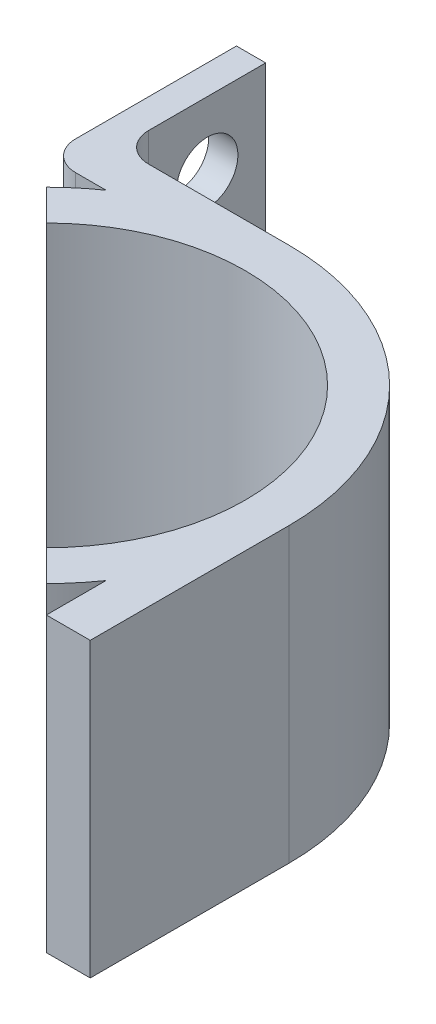
ISO-10303-21;
HEADER;
FILE_DESCRIPTION(('STEP AP214'),'2;1');
FILE_NAME('part.step','',(''),(''),'','','');
FILE_SCHEMA(('AUTOMOTIVE_DESIGN { 1 0 10303 214 1 1 1 1 }'));
ENDSEC;
DATA;
#1=APPLICATION_CONTEXT('core data for automotive mechanical design processes');
#2=APPLICATION_PROTOCOL_DEFINITION('international standard','automotive_design',2000,#1);
#3=PRODUCT_CONTEXT('',#1,'mechanical');
#4=PRODUCT('Part','Part','',(#3));
#5=PRODUCT_RELATED_PRODUCT_CATEGORY('part','',(#4));
#6=PRODUCT_DEFINITION_FORMATION('','',#4);
#7=PRODUCT_DEFINITION_CONTEXT('part definition',#1,'design');
#8=PRODUCT_DEFINITION('design','',#6,#7);
#9=PRODUCT_DEFINITION_SHAPE('','',#8);
#10=(LENGTH_UNIT() NAMED_UNIT(*) SI_UNIT(.MILLI.,.METRE.));
#11=(NAMED_UNIT(*) PLANE_ANGLE_UNIT() SI_UNIT($,.RADIAN.));
#12=(NAMED_UNIT(*) SI_UNIT($,.STERADIAN.) SOLID_ANGLE_UNIT());
#13=UNCERTAINTY_MEASURE_WITH_UNIT(LENGTH_MEASURE(1.E-05),#10,'distance_accuracy_value','');
#14=(GEOMETRIC_REPRESENTATION_CONTEXT(3) GLOBAL_UNCERTAINTY_ASSIGNED_CONTEXT((#13)) GLOBAL_UNIT_ASSIGNED_CONTEXT((#10,
#11,#12)) REPRESENTATION_CONTEXT('',''));
#15=CARTESIAN_POINT('',(0.,0.,0.));
#16=DIRECTION('',(0.,0.,1.));
#17=DIRECTION('',(1.,0.,0.));
#18=AXIS2_PLACEMENT_3D('',#15,#16,#17);
#19=CARTESIAN_POINT('',(0.,20.,7.17807043970219));
#20=DIRECTION('',(0.,0.,-1.));
#21=DIRECTION('',(-1.,0.,0.));
#22=AXIS2_PLACEMENT_3D('',#19,#20,#21);
#23=PLANE('',#22);
#24=DIRECTION('',(1.,0.,0.));
#25=VECTOR('',#24,1.);
#26=CARTESIAN_POINT('',(0.,20.,7.17807043970219));
#27=LINE('',#26,#25);
#28=CARTESIAN_POINT('',(-28.2,20.,7.17807043970219));
#29=VERTEX_POINT('',#28);
#30=CARTESIAN_POINT('',(-26.1184032274326,20.,7.17807043970219));
#31=VERTEX_POINT('',#30);
#32=EDGE_CURVE('E195',#29,#31,#27,.T.);
#33=ORIENTED_EDGE('',*,*,#32,.F.);
#34=DIRECTION('',(0.,-1.,0.));
#35=VECTOR('',#34,1.);
#36=CARTESIAN_POINT('',(-28.2,20.,7.17807043970219));
#37=LINE('',#36,#35);
#38=CARTESIAN_POINT('',(-28.2,0.,7.17807043970219));
#39=VERTEX_POINT('',#38);
#40=EDGE_CURVE('E323',#29,#39,#37,.T.);
#41=ORIENTED_EDGE('',*,*,#40,.T.);
#42=DIRECTION('',(1.,0.,0.));
#43=VECTOR('',#42,1.);
#44=CARTESIAN_POINT('',(0.,0.,7.17807043970219));
#45=LINE('',#44,#43);
#46=CARTESIAN_POINT('',(-26.1184032274326,0.,7.17807043970219));
#47=VERTEX_POINT('',#46);
#48=EDGE_CURVE('E193',#39,#47,#45,.T.);
#49=ORIENTED_EDGE('',*,*,#48,.T.);
#50=DIRECTION('',(0.,-1.,0.));
#51=VECTOR('',#50,1.);
#52=CARTESIAN_POINT('',(-26.1184032274326,20.,7.17807043970219));
#53=LINE('',#52,#51);
#54=EDGE_CURVE('E307',#31,#47,#53,.T.);
#55=ORIENTED_EDGE('',*,*,#54,.F.);
#56=EDGE_LOOP('',(#33,#41,#49,#55));
#57=FACE_BOUND('',#56,.T.);
#58=ADVANCED_FACE('F45',(#57),#23,.F.);
#59=CARTESIAN_POINT('',(-16.6,20.,20.7780704397022));
#60=DIRECTION('',(0.,-1.,0.));
#61=DIRECTION('',(0.,0.,-1.));
#62=AXIS2_PLACEMENT_3D('',#59,#60,#61);
#63=CYLINDRICAL_SURFACE('',#62,16.6);
#64=CARTESIAN_POINT('',(-16.6,0.,20.7780704397022));
#65=DIRECTION('',(0.,1.,0.));
#66=DIRECTION('',(0.,0.,1.));
#67=AXIS2_PLACEMENT_3D('',#64,#65,#66);
#68=CIRCLE('',#67,16.6);
#69=CARTESIAN_POINT('',(-28.3379725676967,0.,9.0400978720055));
#70=VERTEX_POINT('',#69);
#71=EDGE_CURVE('E239',#47,#70,#68,.T.);
#72=ORIENTED_EDGE('',*,*,#71,.T.);
#73=DIRECTION('',(0.,-1.,0.));
#74=VECTOR('',#73,1.);
#75=CARTESIAN_POINT('',(-28.3379725676967,20.,9.0400978720055));
#76=LINE('',#75,#74);
#77=CARTESIAN_POINT('',(-28.3379725676967,20.,9.0400978720055));
#78=VERTEX_POINT('',#77);
#79=EDGE_CURVE('E304',#78,#70,#76,.T.);
#80=ORIENTED_EDGE('',*,*,#79,.F.);
#81=CARTESIAN_POINT('',(-16.6,20.,20.7780704397022));
#82=DIRECTION('',(0.,1.,0.));
#83=DIRECTION('',(0.,0.,1.));
#84=AXIS2_PLACEMENT_3D('',#81,#82,#83);
#85=CIRCLE('',#84,16.6);
#86=EDGE_CURVE('E198',#31,#78,#85,.T.);
#87=ORIENTED_EDGE('',*,*,#86,.F.);
#88=ORIENTED_EDGE('',*,*,#54,.T.);
#89=EDGE_LOOP('',(#72,#80,#87,#88));
#90=FACE_BOUND('',#89,.T.);
#91=ADVANCED_FACE('F340',(#90),#63,.T.);
#92=CARTESIAN_POINT('',(-18.6890352198511,20.,18.6890352198511));
#93=DIRECTION('',(-0.707106781186548,0.,0.707106781186548));
#94=DIRECTION('',(0.707106781186548,0.,0.707106781186548));
#95=AXIS2_PLACEMENT_3D('',#92,#93,#94);
#96=PLANE('',#95);
#97=DIRECTION('',(-0.707106781186548,0.,-0.707106781186548));
#98=VECTOR('',#97,1.);
#99=CARTESIAN_POINT('',(-18.6890352198511,0.,18.6890352198511));
#100=LINE('',#99,#98);
#101=CARTESIAN_POINT('',(-26.216652224137,0.,11.1614182155651));
#102=VERTEX_POINT('',#101);
#103=EDGE_CURVE('E243',#102,#70,#100,.T.);
#104=ORIENTED_EDGE('',*,*,#103,.F.);
#105=DIRECTION('',(0.,-1.,0.));
#106=VECTOR('',#105,1.);
#107=CARTESIAN_POINT('',(-26.216652224137,20.,11.1614182155651));
#108=LINE('',#107,#106);
#109=CARTESIAN_POINT('',(-26.216652224137,20.,11.1614182155651));
#110=VERTEX_POINT('',#109);
#111=EDGE_CURVE('E301',#110,#102,#108,.T.);
#112=ORIENTED_EDGE('',*,*,#111,.F.);
#113=DIRECTION('',(-0.707106781186548,0.,-0.707106781186548));
#114=VECTOR('',#113,1.);
#115=CARTESIAN_POINT('',(-18.6890352198511,20.,18.6890352198511));
#116=LINE('',#115,#114);
#117=EDGE_CURVE('E201',#110,#78,#116,.T.);
#118=ORIENTED_EDGE('',*,*,#117,.T.);
#119=ORIENTED_EDGE('',*,*,#79,.T.);
#120=EDGE_LOOP('',(#104,#112,#118,#119));
#121=FACE_BOUND('',#120,.T.);
#122=ADVANCED_FACE('F358',(#121),#96,.T.);
#123=CARTESIAN_POINT('',(-16.6,20.,20.7780704397022));
#124=DIRECTION('',(0.,-1.,0.));
#125=DIRECTION('',(0.,0.,-1.));
#126=AXIS2_PLACEMENT_3D('',#123,#124,#125);
#127=CYLINDRICAL_SURFACE('',#126,13.6);
#128=CARTESIAN_POINT('',(-16.6,0.,20.7780704397022));
#129=DIRECTION('',(0.,1.,0.));
#130=DIRECTION('',(0.,0.,1.));
#131=AXIS2_PLACEMENT_3D('',#128,#129,#130);
#132=CIRCLE('',#131,13.6);
#133=CARTESIAN_POINT('',(-6.98334777586295,0.,30.3947226638392));
#134=VERTEX_POINT('',#133);
#135=EDGE_CURVE('E247',#134,#102,#132,.T.);
#136=ORIENTED_EDGE('',*,*,#135,.F.);
#137=DIRECTION('',(0.,-1.,0.));
#138=VECTOR('',#137,1.);
#139=CARTESIAN_POINT('',(-6.98334777586295,20.,30.3947226638392));
#140=LINE('',#139,#138);
#141=CARTESIAN_POINT('',(-6.98334777586295,20.,30.3947226638392));
#142=VERTEX_POINT('',#141);
#143=EDGE_CURVE('E298',#142,#134,#140,.T.);
#144=ORIENTED_EDGE('',*,*,#143,.F.);
#145=CARTESIAN_POINT('',(-16.6,20.,20.7780704397022));
#146=DIRECTION('',(0.,1.,0.));
#147=DIRECTION('',(0.,0.,1.));
#148=AXIS2_PLACEMENT_3D('',#145,#146,#147);
#149=CIRCLE('',#148,13.6);
#150=EDGE_CURVE('E205',#142,#110,#149,.T.);
#151=ORIENTED_EDGE('',*,*,#150,.T.);
#152=ORIENTED_EDGE('',*,*,#111,.T.);
#153=EDGE_LOOP('',(#136,#144,#151,#152));
#154=FACE_BOUND('',#153,.T.);
#155=ADVANCED_FACE('F407',(#154),#127,.F.);
#156=CARTESIAN_POINT('',(-18.6890352198511,20.,18.6890352198511));
#157=DIRECTION('',(0.707106781186548,0.,-0.707106781186548));
#158=DIRECTION('',(-0.707106781186548,0.,-0.707106781186548));
#159=AXIS2_PLACEMENT_3D('',#156,#157,#158);
#160=PLANE('',#159);
#161=DIRECTION('',(0.707106781186548,0.,0.707106781186548));
#162=VECTOR('',#161,1.);
#163=CARTESIAN_POINT('',(-18.6890352198511,0.,18.6890352198511));
#164=LINE('',#163,#162);
#165=CARTESIAN_POINT('',(-4.86202743230331,0.,32.5160430073989));
#166=VERTEX_POINT('',#165);
#167=EDGE_CURVE('E251',#134,#166,#164,.T.);
#168=ORIENTED_EDGE('',*,*,#167,.T.);
#169=DIRECTION('',(0.,-1.,0.));
#170=VECTOR('',#169,1.);
#171=CARTESIAN_POINT('',(-4.86202743230331,20.,32.5160430073989));
#172=LINE('',#171,#170);
#173=CARTESIAN_POINT('',(-4.86202743230331,20.,32.5160430073989));
#174=VERTEX_POINT('',#173);
#175=EDGE_CURVE('E294',#174,#166,#172,.T.);
#176=ORIENTED_EDGE('',*,*,#175,.F.);
#177=DIRECTION('',(0.707106781186548,0.,0.707106781186548));
#178=VECTOR('',#177,1.);
#179=CARTESIAN_POINT('',(-18.6890352198511,20.,18.6890352198511));
#180=LINE('',#179,#178);
#181=EDGE_CURVE('E209',#142,#174,#180,.T.);
#182=ORIENTED_EDGE('',*,*,#181,.F.);
#183=ORIENTED_EDGE('',*,*,#143,.T.);
#184=EDGE_LOOP('',(#168,#176,#182,#183));
#185=FACE_BOUND('',#184,.T.);
#186=ADVANCED_FACE('F404',(#185),#160,.F.);
#187=CARTESIAN_POINT('',(-16.6,20.,20.7780704397022));
#188=DIRECTION('',(0.,-1.,0.));
#189=DIRECTION('',(0.,0.,-1.));
#190=AXIS2_PLACEMENT_3D('',#187,#188,#189);
#191=CYLINDRICAL_SURFACE('',#190,16.6);
#192=CARTESIAN_POINT('',(-16.6,0.,20.7780704397022));
#193=DIRECTION('',(0.,1.,0.));
#194=DIRECTION('',(0.,0.,1.));
#195=AXIS2_PLACEMENT_3D('',#192,#193,#194);
#196=CIRCLE('',#195,16.6);
#197=CARTESIAN_POINT('',(-2.99999999999999,0.,30.2964736671348));
#198=VERTEX_POINT('',#197);
#199=EDGE_CURVE('E254',#166,#198,#196,.T.);
#200=ORIENTED_EDGE('',*,*,#199,.T.);
#201=DIRECTION('',(0.,-1.,0.));
#202=VECTOR('',#201,1.);
#203=CARTESIAN_POINT('',(-2.99999999999999,20.,30.2964736671348));
#204=LINE('',#203,#202);
#205=CARTESIAN_POINT('',(-2.99999999999999,20.,30.2964736671348));
#206=VERTEX_POINT('',#205);
#207=EDGE_CURVE('E290',#206,#198,#204,.T.);
#208=ORIENTED_EDGE('',*,*,#207,.F.);
#209=CARTESIAN_POINT('',(-16.6,20.,20.7780704397022));
#210=DIRECTION('',(0.,1.,0.));
#211=DIRECTION('',(0.,0.,1.));
#212=AXIS2_PLACEMENT_3D('',#209,#210,#211);
#213=CIRCLE('',#212,16.6);
#214=EDGE_CURVE('E212',#174,#206,#213,.T.);
#215=ORIENTED_EDGE('',*,*,#214,.F.);
#216=ORIENTED_EDGE('',*,*,#175,.T.);
#217=EDGE_LOOP('',(#200,#208,#215,#216));
#218=FACE_BOUND('',#217,.T.);
#219=ADVANCED_FACE('F400',(#218),#191,.T.);
#220=CARTESIAN_POINT('',(-2.99999999999999,20.,0.));
#221=DIRECTION('',(1.,0.,0.));
#222=DIRECTION('',(0.,0.,-1.));
#223=AXIS2_PLACEMENT_3D('',#220,#221,#222);
#224=PLANE('',#223);
#225=DIRECTION('',(0.,0.,1.));
#226=VECTOR('',#225,1.);
#227=CARTESIAN_POINT('',(-2.99999999999999,0.,0.));
#228=LINE('',#227,#226);
#229=CARTESIAN_POINT('',(-2.99999999999999,0.,34.3780704397022));
#230=VERTEX_POINT('',#229);
#231=EDGE_CURVE('E257',#198,#230,#228,.T.);
#232=ORIENTED_EDGE('',*,*,#231,.T.);
#233=DIRECTION('',(0.,-1.,0.));
#234=VECTOR('',#233,1.);
#235=CARTESIAN_POINT('',(-2.99999999999999,20.,34.3780704397022));
#236=LINE('',#235,#234);
#237=CARTESIAN_POINT('',(-2.99999999999999,20.,34.3780704397022));
#238=VERTEX_POINT('',#237);
#239=EDGE_CURVE('E287',#238,#230,#236,.T.);
#240=ORIENTED_EDGE('',*,*,#239,.F.);
#241=DIRECTION('',(0.,0.,1.));
#242=VECTOR('',#241,1.);
#243=CARTESIAN_POINT('',(-2.99999999999999,20.,0.));
#244=LINE('',#243,#242);
#245=EDGE_CURVE('E215',#206,#238,#244,.T.);
#246=ORIENTED_EDGE('',*,*,#245,.F.);
#247=ORIENTED_EDGE('',*,*,#207,.T.);
#248=EDGE_LOOP('',(#232,#240,#246,#247));
#249=FACE_BOUND('',#248,.T.);
#250=ADVANCED_FACE('F395',(#249),#224,.F.);
#251=CARTESIAN_POINT('',(0.,20.,34.3780704397022));
#252=DIRECTION('',(0.,0.,1.));
#253=DIRECTION('',(1.,0.,0.));
#254=AXIS2_PLACEMENT_3D('',#251,#252,#253);
#255=PLANE('',#254);
#256=DIRECTION('',(-1.,0.,0.));
#257=VECTOR('',#256,1.);
#258=CARTESIAN_POINT('',(0.,0.,34.3780704397022));
#259=LINE('',#258,#257);
#260=CARTESIAN_POINT('',(0.,0.,34.3780704397022));
#261=VERTEX_POINT('',#260);
#262=EDGE_CURVE('E261',#261,#230,#259,.T.);
#263=ORIENTED_EDGE('',*,*,#262,.F.);
#264=DIRECTION('',(0.,-1.,0.));
#265=VECTOR('',#264,1.);
#266=CARTESIAN_POINT('',(0.,20.,34.3780704397022));
#267=LINE('',#266,#265);
#268=CARTESIAN_POINT('',(0.,20.,34.3780704397022));
#269=VERTEX_POINT('',#268);
#270=EDGE_CURVE('E284',#269,#261,#267,.T.);
#271=ORIENTED_EDGE('',*,*,#270,.F.);
#272=DIRECTION('',(-1.,0.,0.));
#273=VECTOR('',#272,1.);
#274=CARTESIAN_POINT('',(0.,20.,34.3780704397022));
#275=LINE('',#274,#273);
#276=EDGE_CURVE('E218',#269,#238,#275,.T.);
#277=ORIENTED_EDGE('',*,*,#276,.T.);
#278=ORIENTED_EDGE('',*,*,#239,.T.);
#279=EDGE_LOOP('',(#263,#271,#277,#278));
#280=FACE_BOUND('',#279,.T.);
#281=ADVANCED_FACE('F389',(#280),#255,.T.);
#282=CARTESIAN_POINT('',(0.,20.,0.));
#283=DIRECTION('',(1.,0.,0.));
#284=DIRECTION('',(0.,0.,-1.));
#285=AXIS2_PLACEMENT_3D('',#282,#283,#284);
#286=PLANE('',#285);
#287=DIRECTION('',(0.,0.,1.));
#288=VECTOR('',#287,1.);
#289=CARTESIAN_POINT('',(0.,0.,0.));
#290=LINE('',#289,#288);
#291=CARTESIAN_POINT('',(0.,0.,20.7780704397022));
#292=VERTEX_POINT('',#291);
#293=EDGE_CURVE('E265',#292,#261,#290,.T.);
#294=ORIENTED_EDGE('',*,*,#293,.F.);
#295=DIRECTION('',(0.,-1.,0.));
#296=VECTOR('',#295,1.);
#297=CARTESIAN_POINT('',(0.,20.,20.7780704397022));
#298=LINE('',#297,#296);
#299=CARTESIAN_POINT('',(0.,20.,20.7780704397022));
#300=VERTEX_POINT('',#299);
#301=EDGE_CURVE('E281',#300,#292,#298,.T.);
#302=ORIENTED_EDGE('',*,*,#301,.F.);
#303=DIRECTION('',(0.,0.,1.));
#304=VECTOR('',#303,1.);
#305=CARTESIAN_POINT('',(0.,20.,0.));
#306=LINE('',#305,#304);
#307=EDGE_CURVE('E222',#300,#269,#306,.T.);
#308=ORIENTED_EDGE('',*,*,#307,.T.);
#309=ORIENTED_EDGE('',*,*,#270,.T.);
#310=EDGE_LOOP('',(#294,#302,#308,#309));
#311=FACE_BOUND('',#310,.T.);
#312=ADVANCED_FACE('F385',(#311),#286,.T.);
#313=CARTESIAN_POINT('',(-16.6,20.,20.7780704397022));
#314=DIRECTION('',(0.,-1.,0.));
#315=DIRECTION('',(0.,0.,-1.));
#316=AXIS2_PLACEMENT_3D('',#313,#314,#315);
#317=CYLINDRICAL_SURFACE('',#316,16.6);
#318=CARTESIAN_POINT('',(-16.6,0.,20.7780704397022));
#319=DIRECTION('',(0.,1.,0.));
#320=DIRECTION('',(0.,0.,1.));
#321=AXIS2_PLACEMENT_3D('',#318,#319,#320);
#322=CIRCLE('',#321,16.6);
#323=CARTESIAN_POINT('',(-16.6,0.,4.17807043970219));
#324=VERTEX_POINT('',#323);
#325=EDGE_CURVE('E269',#292,#324,#322,.T.);
#326=ORIENTED_EDGE('',*,*,#325,.T.);
#327=DIRECTION('',(0.,-1.,0.));
#328=VECTOR('',#327,1.);
#329=CARTESIAN_POINT('',(-16.6,20.,4.17807043970219));
#330=LINE('',#329,#328);
#331=CARTESIAN_POINT('',(-16.6,20.,4.17807043970219));
#332=VERTEX_POINT('',#331);
#333=EDGE_CURVE('E236',#332,#324,#330,.T.);
#334=ORIENTED_EDGE('',*,*,#333,.F.);
#335=CARTESIAN_POINT('',(-16.6,20.,20.7780704397022));
#336=DIRECTION('',(0.,1.,0.));
#337=DIRECTION('',(0.,0.,1.));
#338=AXIS2_PLACEMENT_3D('',#335,#336,#337);
#339=CIRCLE('',#338,16.6);
#340=EDGE_CURVE('E226',#300,#332,#339,.T.);
#341=ORIENTED_EDGE('',*,*,#340,.F.);
#342=ORIENTED_EDGE('',*,*,#301,.T.);
#343=EDGE_LOOP('',(#326,#334,#341,#342));
#344=FACE_BOUND('',#343,.T.);
#345=ADVANCED_FACE('F381',(#344),#317,.T.);
#346=CARTESIAN_POINT('',(0.,20.,4.17807043970218));
#347=DIRECTION('',(0.,0.,1.));
#348=DIRECTION('',(1.,0.,0.));
#349=AXIS2_PLACEMENT_3D('',#346,#347,#348);
#350=PLANE('',#349);
#351=DIRECTION('',(-1.,0.,0.));
#352=VECTOR('',#351,1.);
#353=CARTESIAN_POINT('',(0.,0.,4.17807043970218));
#354=LINE('',#353,#352);
#355=CARTESIAN_POINT('',(-26.2,0.,4.17807043970219));
#356=VERTEX_POINT('',#355);
#357=EDGE_CURVE('E272',#324,#356,#354,.T.);
#358=ORIENTED_EDGE('',*,*,#357,.T.);
#359=DIRECTION('',(0.,1.,0.));
#360=VECTOR('',#359,1.);
#361=CARTESIAN_POINT('',(-26.2,20.,4.17807043970219));
#362=LINE('',#361,#360);
#363=CARTESIAN_POINT('',(-26.2,20.,4.17807043970219));
#364=VERTEX_POINT('',#363);
#365=EDGE_CURVE('E311',#356,#364,#362,.T.);
#366=ORIENTED_EDGE('',*,*,#365,.T.);
#367=DIRECTION('',(-1.,0.,0.));
#368=VECTOR('',#367,1.);
#369=CARTESIAN_POINT('',(0.,20.,4.17807043970218));
#370=LINE('',#369,#368);
#371=EDGE_CURVE('E229',#332,#364,#370,.T.);
#372=ORIENTED_EDGE('',*,*,#371,.F.);
#373=ORIENTED_EDGE('',*,*,#333,.T.);
#374=EDGE_LOOP('',(#358,#366,#372,#373));
#375=FACE_BOUND('',#374,.T.);
#376=ADVANCED_FACE('F376',(#375),#350,.F.);
#377=CARTESIAN_POINT('',(-30.2,20.,0.));
#378=DIRECTION('',(1.,0.,0.));
#379=DIRECTION('',(0.,0.,-1.));
#380=AXIS2_PLACEMENT_3D('',#377,#378,#379);
#381=PLANE('',#380);
#382=CARTESIAN_POINT('',(-30.2,15.5,-1.82192956029781));
#383=DIRECTION('',(1.,0.,0.));
#384=DIRECTION('',(0.,0.,-1.));
#385=AXIS2_PLACEMENT_3D('',#382,#383,#384);
#386=CIRCLE('',#385,2.1);
#387=CARTESIAN_POINT('',(-30.2,15.5,-3.92192956029781));
#388=VERTEX_POINT('',#387);
#389=EDGE_CURVE('E189',#388,#388,#386,.T.);
#390=ORIENTED_EDGE('',*,*,#389,.T.);
#391=EDGE_LOOP('',(#390));
#392=FACE_BOUND('',#391,.T.);
#393=CARTESIAN_POINT('',(-30.2,4.5,-1.82192956029781));
#394=DIRECTION('',(1.,0.,0.));
#395=DIRECTION('',(0.,0.,-1.));
#396=AXIS2_PLACEMENT_3D('',#393,#394,#395);
#397=CIRCLE('',#396,2.1);
#398=CARTESIAN_POINT('',(-30.2,4.5,-3.92192956029781));
#399=VERTEX_POINT('',#398);
#400=EDGE_CURVE('E616',#399,#399,#397,.T.);
#401=ORIENTED_EDGE('',*,*,#400,.T.);
#402=EDGE_LOOP('',(#401));
#403=FACE_BOUND('',#402,.T.);
#404=DIRECTION('',(0.,0.,1.));
#405=VECTOR('',#404,1.);
#406=CARTESIAN_POINT('',(-30.2,0.,0.));
#407=LINE('',#406,#405);
#408=CARTESIAN_POINT('',(-30.2,0.,-5.82192956029781));
#409=VERTEX_POINT('',#408);
#410=CARTESIAN_POINT('',(-30.2,0.,5.17807043970219));
#411=VERTEX_POINT('',#410);
#412=EDGE_CURVE('E180',#409,#411,#407,.T.);
#413=ORIENTED_EDGE('',*,*,#412,.T.);
#414=DIRECTION('',(0.,-1.,0.));
#415=VECTOR('',#414,1.);
#416=CARTESIAN_POINT('',(-30.2,20.,5.17807043970219));
#417=LINE('',#416,#415);
#418=CARTESIAN_POINT('',(-30.2,20.,5.17807043970219));
#419=VERTEX_POINT('',#418);
#420=EDGE_CURVE('E54',#411,#419,#417,.F.);
#421=ORIENTED_EDGE('',*,*,#420,.T.);
#422=DIRECTION('',(0.,0.,1.));
#423=VECTOR('',#422,1.);
#424=CARTESIAN_POINT('',(-30.2,20.,0.));
#425=LINE('',#424,#423);
#426=CARTESIAN_POINT('',(-30.2,20.,-5.82192956029781));
#427=VERTEX_POINT('',#426);
#428=EDGE_CURVE('E233',#427,#419,#425,.T.);
#429=ORIENTED_EDGE('',*,*,#428,.F.);
#430=DIRECTION('',(0.,1.,0.));
#431=VECTOR('',#430,1.);
#432=CARTESIAN_POINT('',(-30.2,0.,-5.82192956029781));
#433=LINE('',#432,#431);
#434=EDGE_CURVE('E177',#409,#427,#433,.T.);
#435=ORIENTED_EDGE('',*,*,#434,.F.);
#436=EDGE_LOOP('',(#413,#421,#429,#435));
#437=FACE_BOUND('',#436,.T.);
#438=ADVANCED_FACE('F429',(#392,#403,#437),#381,.F.);
#439=CARTESIAN_POINT('',(0.,20.,0.));
#440=DIRECTION('',(0.,1.,0.));
#441=DIRECTION('',(0.,0.,1.));
#442=AXIS2_PLACEMENT_3D('',#439,#440,#441);
#443=PLANE('',#442);
#444=ORIENTED_EDGE('',*,*,#428,.T.);
#445=CARTESIAN_POINT('',(-28.2,20.,5.17807043970219));
#446=DIRECTION('',(0.,1.,0.));
#447=DIRECTION('',(0.,0.,1.));
#448=AXIS2_PLACEMENT_3D('',#445,#446,#447);
#449=CIRCLE('',#448,2.);
#450=EDGE_CURVE('E11',#419,#29,#449,.T.);
#451=ORIENTED_EDGE('',*,*,#450,.T.);
#452=ORIENTED_EDGE('',*,*,#32,.T.);
#453=ORIENTED_EDGE('',*,*,#86,.T.);
#454=ORIENTED_EDGE('',*,*,#117,.F.);
#455=ORIENTED_EDGE('',*,*,#150,.F.);
#456=ORIENTED_EDGE('',*,*,#181,.T.);
#457=ORIENTED_EDGE('',*,*,#214,.T.);
#458=ORIENTED_EDGE('',*,*,#245,.T.);
#459=ORIENTED_EDGE('',*,*,#276,.F.);
#460=ORIENTED_EDGE('',*,*,#307,.F.);
#461=ORIENTED_EDGE('',*,*,#340,.T.);
#462=ORIENTED_EDGE('',*,*,#371,.T.);
#463=CARTESIAN_POINT('',(-26.2,20.,2.17807043970219));
#464=DIRECTION('',(0.,1.,0.));
#465=DIRECTION('',(0.,0.,1.));
#466=AXIS2_PLACEMENT_3D('',#463,#464,#465);
#467=CIRCLE('',#466,2.);
#468=CARTESIAN_POINT('',(-28.2,20.,2.17807043970219));
#469=VERTEX_POINT('',#468);
#470=EDGE_CURVE('E317',#364,#469,#467,.F.);
#471=ORIENTED_EDGE('',*,*,#470,.T.);
#472=DIRECTION('',(0.,0.,-1.));
#473=VECTOR('',#472,1.);
#474=CARTESIAN_POINT('',(-28.2,20.,-5.82192956029781));
#475=LINE('',#474,#473);
#476=CARTESIAN_POINT('',(-28.2,20.,-5.82192956029781));
#477=VERTEX_POINT('',#476);
#478=EDGE_CURVE('E186',#469,#477,#475,.T.);
#479=ORIENTED_EDGE('',*,*,#478,.T.);
#480=DIRECTION('',(-1.,0.,0.));
#481=VECTOR('',#480,1.);
#482=CARTESIAN_POINT('',(-30.2,20.,-5.82192956029781));
#483=LINE('',#482,#481);
#484=EDGE_CURVE('E169',#477,#427,#483,.T.);
#485=ORIENTED_EDGE('',*,*,#484,.T.);
#486=EDGE_LOOP('',(#444,#451,#452,#453,#454,#455,#456,#457,#458,#459,#460,#461,#462,#471,#479,#485));
#487=FACE_BOUND('',#486,.T.);
#488=ADVANCED_FACE('F343',(#487),#443,.T.);
#489=CARTESIAN_POINT('',(0.,0.,0.));
#490=DIRECTION('',(0.,1.,0.));
#491=DIRECTION('',(0.,0.,1.));
#492=AXIS2_PLACEMENT_3D('',#489,#490,#491);
#493=PLANE('',#492);
#494=ORIENTED_EDGE('',*,*,#48,.F.);
#495=CARTESIAN_POINT('',(-28.2,0.,5.17807043970219));
#496=DIRECTION('',(0.,1.,0.));
#497=DIRECTION('',(0.,0.,1.));
#498=AXIS2_PLACEMENT_3D('',#495,#496,#497);
#499=CIRCLE('',#498,2.);
#500=EDGE_CURVE('E68',#39,#411,#499,.F.);
#501=ORIENTED_EDGE('',*,*,#500,.T.);
#502=ORIENTED_EDGE('',*,*,#412,.F.);
#503=DIRECTION('',(-1.,0.,0.));
#504=VECTOR('',#503,1.);
#505=CARTESIAN_POINT('',(-30.2,0.,-5.82192956029781));
#506=LINE('',#505,#504);
#507=CARTESIAN_POINT('',(-28.2,0.,-5.82192956029781));
#508=VERTEX_POINT('',#507);
#509=EDGE_CURVE('E168',#508,#409,#506,.T.);
#510=ORIENTED_EDGE('',*,*,#509,.F.);
#511=DIRECTION('',(0.,0.,-1.));
#512=VECTOR('',#511,1.);
#513=CARTESIAN_POINT('',(-28.2,0.,-5.82192956029781));
#514=LINE('',#513,#512);
#515=CARTESIAN_POINT('',(-28.2,0.,2.17807043970219));
#516=VERTEX_POINT('',#515);
#517=EDGE_CURVE('E157',#516,#508,#514,.T.);
#518=ORIENTED_EDGE('',*,*,#517,.F.);
#519=CARTESIAN_POINT('',(-26.2,0.,2.17807043970219));
#520=DIRECTION('',(0.,1.,0.));
#521=DIRECTION('',(0.,0.,1.));
#522=AXIS2_PLACEMENT_3D('',#519,#520,#521);
#523=CIRCLE('',#522,2.);
#524=EDGE_CURVE('E320',#516,#356,#523,.T.);
#525=ORIENTED_EDGE('',*,*,#524,.T.);
#526=ORIENTED_EDGE('',*,*,#357,.F.);
#527=ORIENTED_EDGE('',*,*,#325,.F.);
#528=ORIENTED_EDGE('',*,*,#293,.T.);
#529=ORIENTED_EDGE('',*,*,#262,.T.);
#530=ORIENTED_EDGE('',*,*,#231,.F.);
#531=ORIENTED_EDGE('',*,*,#199,.F.);
#532=ORIENTED_EDGE('',*,*,#167,.F.);
#533=ORIENTED_EDGE('',*,*,#135,.T.);
#534=ORIENTED_EDGE('',*,*,#103,.T.);
#535=ORIENTED_EDGE('',*,*,#71,.F.);
#536=EDGE_LOOP('',(#494,#501,#502,#510,#518,#525,#526,#527,#528,#529,#530,#531,#532,#533,#534,#535));
#537=FACE_BOUND('',#536,.T.);
#538=ADVANCED_FACE('F179',(#537),#493,.F.);
#539=CARTESIAN_POINT('',(-30.2,0.,-5.82192956029781));
#540=DIRECTION('',(0.,0.,-1.));
#541=DIRECTION('',(-1.,0.,0.));
#542=AXIS2_PLACEMENT_3D('',#539,#540,#541);
#543=PLANE('',#542);
#544=ORIENTED_EDGE('',*,*,#484,.F.);
#545=DIRECTION('',(0.,1.,0.));
#546=VECTOR('',#545,1.);
#547=CARTESIAN_POINT('',(-28.2,0.,-5.82192956029781));
#548=LINE('',#547,#546);
#549=EDGE_CURVE('E161',#508,#477,#548,.T.);
#550=ORIENTED_EDGE('',*,*,#549,.F.);
#551=ORIENTED_EDGE('',*,*,#509,.T.);
#552=ORIENTED_EDGE('',*,*,#434,.T.);
#553=EDGE_LOOP('',(#544,#550,#551,#552));
#554=FACE_BOUND('',#553,.T.);
#555=ADVANCED_FACE('F173',(#554),#543,.T.);
#556=CARTESIAN_POINT('',(-28.2,0.,-5.82192956029781));
#557=DIRECTION('',(1.,0.,0.));
#558=DIRECTION('',(0.,0.,-1.));
#559=AXIS2_PLACEMENT_3D('',#556,#557,#558);
#560=PLANE('',#559);
#561=CARTESIAN_POINT('',(-28.2,15.5,-1.82192956029781));
#562=DIRECTION('',(1.,0.,0.));
#563=DIRECTION('',(0.,0.,-1.));
#564=AXIS2_PLACEMENT_3D('',#561,#562,#563);
#565=CIRCLE('',#564,2.1);
#566=CARTESIAN_POINT('',(-28.2,15.5,-3.92192956029781));
#567=VERTEX_POINT('',#566);
#568=EDGE_CURVE('E619',#567,#567,#565,.T.);
#569=ORIENTED_EDGE('',*,*,#568,.F.);
#570=EDGE_LOOP('',(#569));
#571=FACE_BOUND('',#570,.T.);
#572=CARTESIAN_POINT('',(-28.2,4.5,-1.82192956029781));
#573=DIRECTION('',(1.,0.,0.));
#574=DIRECTION('',(0.,0.,-1.));
#575=AXIS2_PLACEMENT_3D('',#572,#573,#574);
#576=CIRCLE('',#575,2.1);
#577=CARTESIAN_POINT('',(-28.2,4.5,-3.92192956029781));
#578=VERTEX_POINT('',#577);
#579=EDGE_CURVE('E624',#578,#578,#576,.T.);
#580=ORIENTED_EDGE('',*,*,#579,.F.);
#581=EDGE_LOOP('',(#580));
#582=FACE_BOUND('',#581,.T.);
#583=ORIENTED_EDGE('',*,*,#478,.F.);
#584=DIRECTION('',(0.,1.,0.));
#585=VECTOR('',#584,1.);
#586=CARTESIAN_POINT('',(-28.2,0.,2.17807043970219));
#587=LINE('',#586,#585);
#588=EDGE_CURVE('E164',#469,#516,#587,.F.);
#589=ORIENTED_EDGE('',*,*,#588,.T.);
#590=ORIENTED_EDGE('',*,*,#517,.T.);
#591=ORIENTED_EDGE('',*,*,#549,.T.);
#592=EDGE_LOOP('',(#583,#589,#590,#591));
#593=FACE_BOUND('',#592,.T.);
#594=ADVANCED_FACE('F160',(#571,#582,#593),#560,.T.);
#595=CARTESIAN_POINT('',(-26.2,20.,2.17807043970219));
#596=DIRECTION('',(0.,1.,0.));
#597=DIRECTION('',(0.,0.,1.));
#598=AXIS2_PLACEMENT_3D('',#595,#596,#597);
#599=CYLINDRICAL_SURFACE('',#598,2.);
#600=ORIENTED_EDGE('',*,*,#524,.F.);
#601=ORIENTED_EDGE('',*,*,#588,.F.);
#602=ORIENTED_EDGE('',*,*,#470,.F.);
#603=ORIENTED_EDGE('',*,*,#365,.F.);
#604=EDGE_LOOP('',(#600,#601,#602,#603));
#605=FACE_BOUND('',#604,.T.);
#606=ADVANCED_FACE('F361',(#605),#599,.F.);
#607=CARTESIAN_POINT('',(-48.2,4.5,-1.82192956029781));
#608=DIRECTION('',(1.,0.,0.));
#609=DIRECTION('',(0.,0.,-1.));
#610=AXIS2_PLACEMENT_3D('',#607,#608,#609);
#611=CYLINDRICAL_SURFACE('',#610,2.1);
#612=ORIENTED_EDGE('',*,*,#579,.T.);
#613=EDGE_LOOP('',(#612));
#614=FACE_BOUND('',#613,.T.);
#615=ORIENTED_EDGE('',*,*,#400,.F.);
#616=EDGE_LOOP('',(#615));
#617=FACE_BOUND('',#616,.T.);
#618=ADVANCED_FACE('F350',(#614,#617),#611,.F.);
#619=CARTESIAN_POINT('',(-48.2,15.5,-1.82192956029781));
#620=DIRECTION('',(1.,0.,0.));
#621=DIRECTION('',(0.,0.,-1.));
#622=AXIS2_PLACEMENT_3D('',#619,#620,#621);
#623=CYLINDRICAL_SURFACE('',#622,2.1);
#624=ORIENTED_EDGE('',*,*,#568,.T.);
#625=EDGE_LOOP('',(#624));
#626=FACE_BOUND('',#625,.T.);
#627=ORIENTED_EDGE('',*,*,#389,.F.);
#628=EDGE_LOOP('',(#627));
#629=FACE_BOUND('',#628,.T.);
#630=ADVANCED_FACE('F346',(#626,#629),#623,.F.);
#631=CARTESIAN_POINT('',(-28.2,20.,5.17807043970219));
#632=DIRECTION('',(0.,-1.,0.));
#633=DIRECTION('',(0.,0.,-1.));
#634=AXIS2_PLACEMENT_3D('',#631,#632,#633);
#635=CYLINDRICAL_SURFACE('',#634,2.);
#636=ORIENTED_EDGE('',*,*,#450,.F.);
#637=ORIENTED_EDGE('',*,*,#420,.F.);
#638=ORIENTED_EDGE('',*,*,#500,.F.);
#639=ORIENTED_EDGE('',*,*,#40,.F.);
#640=EDGE_LOOP('',(#636,#637,#638,#639));
#641=FACE_BOUND('',#640,.T.);
#642=ADVANCED_FACE('F47',(#641),#635,.T.);
#643=CLOSED_SHELL('',(#58,#91,#122,#155,#186,#219,#250,#281,#312,#345,#376,#438,#488,#538,#555,
#594,#606,#618,#630,#642));
#644=MANIFOLD_SOLID_BREP('B2',#643);
#645=ADVANCED_BREP_SHAPE_REPRESENTATION('',(#18,#644),#14);
#646=SHAPE_DEFINITION_REPRESENTATION(#9,#645);
ENDSEC;
END-ISO-10303-21;
